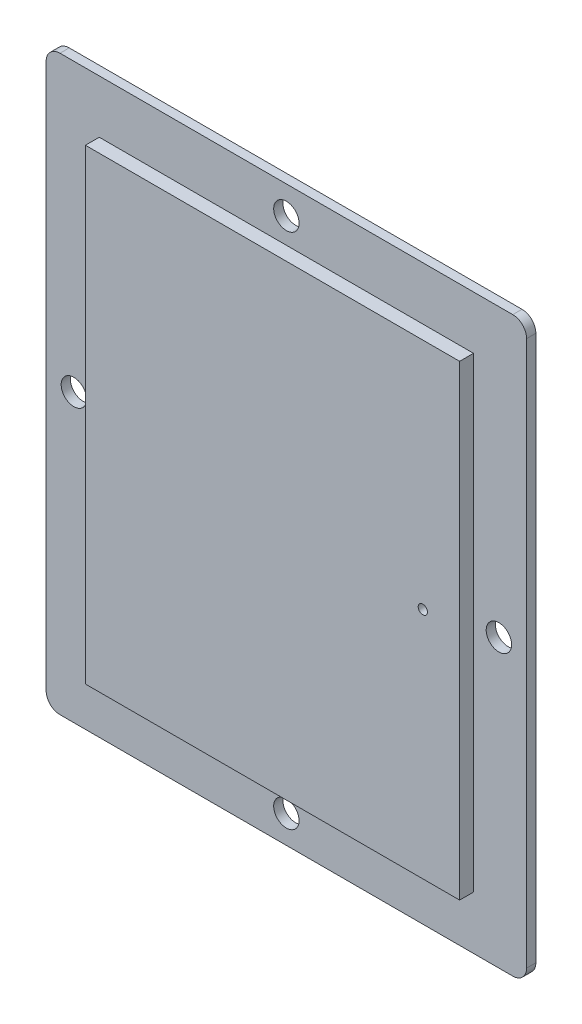
ISO-10303-21;
HEADER;
FILE_DESCRIPTION(('STEP AP214'),'2;1');
FILE_NAME('part.step','',(''),(''),'','','');
FILE_SCHEMA(('AUTOMOTIVE_DESIGN { 1 0 10303 214 1 1 1 1 }'));
ENDSEC;
DATA;
#1=APPLICATION_CONTEXT('core data for automotive mechanical design processes');
#2=APPLICATION_PROTOCOL_DEFINITION('international standard','automotive_design',2000,#1);
#3=PRODUCT_CONTEXT('',#1,'mechanical');
#4=PRODUCT('Part','Part','',(#3));
#5=PRODUCT_RELATED_PRODUCT_CATEGORY('part','',(#4));
#6=PRODUCT_DEFINITION_FORMATION('','',#4);
#7=PRODUCT_DEFINITION_CONTEXT('part definition',#1,'design');
#8=PRODUCT_DEFINITION('design','',#6,#7);
#9=PRODUCT_DEFINITION_SHAPE('','',#8);
#10=(LENGTH_UNIT() NAMED_UNIT(*) SI_UNIT(.MILLI.,.METRE.));
#11=(NAMED_UNIT(*) PLANE_ANGLE_UNIT() SI_UNIT($,.RADIAN.));
#12=(NAMED_UNIT(*) SI_UNIT($,.STERADIAN.) SOLID_ANGLE_UNIT());
#13=UNCERTAINTY_MEASURE_WITH_UNIT(LENGTH_MEASURE(1.E-05),#10,'distance_accuracy_value','');
#14=(GEOMETRIC_REPRESENTATION_CONTEXT(3) GLOBAL_UNCERTAINTY_ASSIGNED_CONTEXT((#13)) GLOBAL_UNIT_ASSIGNED_CONTEXT((#10,
#11,#12)) REPRESENTATION_CONTEXT('',''));
#15=CARTESIAN_POINT('',(0.,0.,0.));
#16=DIRECTION('',(0.,0.,1.));
#17=DIRECTION('',(1.,0.,0.));
#18=AXIS2_PLACEMENT_3D('',#15,#16,#17);
#19=CARTESIAN_POINT('',(0.,0.,2.));
#20=DIRECTION('',(0.,0.,-1.));
#21=DIRECTION('',(-1.,0.,0.));
#22=AXIS2_PLACEMENT_3D('',#19,#20,#21);
#23=PLANE('',#22);
#24=CARTESIAN_POINT('',(52.,6.,2.));
#25=DIRECTION('',(0.,0.,1.));
#26=DIRECTION('',(1.,0.,0.));
#27=AXIS2_PLACEMENT_3D('',#24,#25,#26);
#28=CIRCLE('',#27,2.75);
#29=CARTESIAN_POINT('',(54.75,6.,2.));
#30=VERTEX_POINT('',#29);
#31=EDGE_CURVE('E462',#30,#30,#28,.T.);
#32=ORIENTED_EDGE('',*,*,#31,.F.);
#33=EDGE_LOOP('',(#32));
#34=FACE_BOUND('',#33,.T.);
#35=CARTESIAN_POINT('',(52.,118.,2.));
#36=DIRECTION('',(0.,0.,1.));
#37=DIRECTION('',(1.,0.,0.));
#38=AXIS2_PLACEMENT_3D('',#35,#36,#37);
#39=CIRCLE('',#38,2.75);
#40=CARTESIAN_POINT('',(54.75,118.,2.));
#41=VERTEX_POINT('',#40);
#42=EDGE_CURVE('E459',#41,#41,#39,.T.);
#43=ORIENTED_EDGE('',*,*,#42,.F.);
#44=EDGE_LOOP('',(#43));
#45=FACE_BOUND('',#44,.T.);
#46=CARTESIAN_POINT('',(98.,62.,2.));
#47=DIRECTION('',(0.,0.,1.));
#48=DIRECTION('',(1.,0.,0.));
#49=AXIS2_PLACEMENT_3D('',#46,#47,#48);
#50=CIRCLE('',#49,2.75000000000001);
#51=CARTESIAN_POINT('',(100.75,62.,2.));
#52=VERTEX_POINT('',#51);
#53=EDGE_CURVE('E451',#52,#52,#50,.T.);
#54=ORIENTED_EDGE('',*,*,#53,.F.);
#55=EDGE_LOOP('',(#54));
#56=FACE_BOUND('',#55,.T.);
#57=CARTESIAN_POINT('',(6.,62.,2.));
#58=DIRECTION('',(0.,0.,1.));
#59=DIRECTION('',(1.,0.,0.));
#60=AXIS2_PLACEMENT_3D('',#57,#58,#59);
#61=CIRCLE('',#60,2.75);
#62=CARTESIAN_POINT('',(8.75,62.,2.));
#63=VERTEX_POINT('',#62);
#64=EDGE_CURVE('E447',#63,#63,#61,.T.);
#65=ORIENTED_EDGE('',*,*,#64,.F.);
#66=EDGE_LOOP('',(#65));
#67=FACE_BOUND('',#66,.T.);
#68=DIRECTION('',(0.,1.,0.));
#69=VECTOR('',#68,1.);
#70=CARTESIAN_POINT('',(104.,0.,2.));
#71=LINE('',#70,#69);
#72=CARTESIAN_POINT('',(104.,3.,2.));
#73=VERTEX_POINT('',#72);
#74=CARTESIAN_POINT('',(104.,121.,2.));
#75=VERTEX_POINT('',#74);
#76=EDGE_CURVE('E170',#73,#75,#71,.T.);
#77=ORIENTED_EDGE('',*,*,#76,.T.);
#78=CARTESIAN_POINT('',(101.,121.,2.));
#79=DIRECTION('',(0.,0.,-1.));
#80=DIRECTION('',(-1.,0.,0.));
#81=AXIS2_PLACEMENT_3D('',#78,#79,#80);
#82=CIRCLE('',#81,3.);
#83=CARTESIAN_POINT('',(101.,124.,2.));
#84=VERTEX_POINT('',#83);
#85=EDGE_CURVE('E204',#75,#84,#82,.F.);
#86=ORIENTED_EDGE('',*,*,#85,.T.);
#87=DIRECTION('',(1.,0.,0.));
#88=VECTOR('',#87,1.);
#89=CARTESIAN_POINT('',(0.,124.,2.));
#90=LINE('',#89,#88);
#91=CARTESIAN_POINT('',(2.99999999999998,124.,2.));
#92=VERTEX_POINT('',#91);
#93=EDGE_CURVE('E166',#92,#84,#90,.T.);
#94=ORIENTED_EDGE('',*,*,#93,.F.);
#95=CARTESIAN_POINT('',(2.99999999999998,121.,2.));
#96=DIRECTION('',(0.,0.,-1.));
#97=DIRECTION('',(-1.,0.,0.));
#98=AXIS2_PLACEMENT_3D('',#95,#96,#97);
#99=CIRCLE('',#98,3.);
#100=CARTESIAN_POINT('',(0.,121.,2.));
#101=VERTEX_POINT('',#100);
#102=EDGE_CURVE('E202',#92,#101,#99,.F.);
#103=ORIENTED_EDGE('',*,*,#102,.T.);
#104=DIRECTION('',(0.,1.,0.));
#105=VECTOR('',#104,1.);
#106=CARTESIAN_POINT('',(0.,0.,2.));
#107=LINE('',#106,#105);
#108=CARTESIAN_POINT('',(0.,3.,2.));
#109=VERTEX_POINT('',#108);
#110=EDGE_CURVE('E163',#109,#101,#107,.T.);
#111=ORIENTED_EDGE('',*,*,#110,.F.);
#112=CARTESIAN_POINT('',(3.,3.,2.));
#113=DIRECTION('',(0.,0.,-1.));
#114=DIRECTION('',(-1.,0.,0.));
#115=AXIS2_PLACEMENT_3D('',#112,#113,#114);
#116=CIRCLE('',#115,3.);
#117=CARTESIAN_POINT('',(3.,0.,2.));
#118=VERTEX_POINT('',#117);
#119=EDGE_CURVE('E60',#109,#118,#116,.F.);
#120=ORIENTED_EDGE('',*,*,#119,.T.);
#121=DIRECTION('',(1.,0.,0.));
#122=VECTOR('',#121,1.);
#123=CARTESIAN_POINT('',(0.,0.,2.));
#124=LINE('',#123,#122);
#125=CARTESIAN_POINT('',(101.,0.,2.));
#126=VERTEX_POINT('',#125);
#127=EDGE_CURVE('E173',#118,#126,#124,.T.);
#128=ORIENTED_EDGE('',*,*,#127,.T.);
#129=CARTESIAN_POINT('',(101.,3.,2.));
#130=DIRECTION('',(0.,0.,-1.));
#131=DIRECTION('',(-1.,0.,0.));
#132=AXIS2_PLACEMENT_3D('',#129,#130,#131);
#133=CIRCLE('',#132,3.);
#134=EDGE_CURVE('E199',#126,#73,#133,.F.);
#135=ORIENTED_EDGE('',*,*,#134,.T.);
#136=EDGE_LOOP('',(#77,#86,#94,#103,#111,#120,#128,#135));
#137=FACE_BOUND('',#136,.T.);
#138=DIRECTION('',(0.,1.,0.));
#139=VECTOR('',#138,1.);
#140=CARTESIAN_POINT('',(92.5,11.5,2.));
#141=LINE('',#140,#139);
#142=CARTESIAN_POINT('',(92.5,11.5,2.));
#143=VERTEX_POINT('',#142);
#144=CARTESIAN_POINT('',(92.5,112.5,2.));
#145=VERTEX_POINT('',#144);
#146=EDGE_CURVE('E153',#143,#145,#141,.T.);
#147=ORIENTED_EDGE('',*,*,#146,.F.);
#148=DIRECTION('',(1.,0.,0.));
#149=VECTOR('',#148,1.);
#150=CARTESIAN_POINT('',(11.5,11.5,2.));
#151=LINE('',#150,#149);
#152=CARTESIAN_POINT('',(11.5,11.5,2.));
#153=VERTEX_POINT('',#152);
#154=EDGE_CURVE('E150',#153,#143,#151,.T.);
#155=ORIENTED_EDGE('',*,*,#154,.F.);
#156=DIRECTION('',(0.,-1.,0.));
#157=VECTOR('',#156,1.);
#158=CARTESIAN_POINT('',(11.5,11.5,2.));
#159=LINE('',#158,#157);
#160=CARTESIAN_POINT('',(11.5,112.5,2.));
#161=VERTEX_POINT('',#160);
#162=EDGE_CURVE('E424',#161,#153,#159,.T.);
#163=ORIENTED_EDGE('',*,*,#162,.F.);
#164=DIRECTION('',(-1.,0.,0.));
#165=VECTOR('',#164,1.);
#166=CARTESIAN_POINT('',(11.5,112.5,2.));
#167=LINE('',#166,#165);
#168=EDGE_CURVE('E426',#145,#161,#167,.T.);
#169=ORIENTED_EDGE('',*,*,#168,.F.);
#170=EDGE_LOOP('',(#147,#155,#163,#169));
#171=FACE_BOUND('',#170,.T.);
#172=ADVANCED_FACE('F39',(#34,#45,#56,#67,#137,#171),#23,.F.);
#173=CARTESIAN_POINT('',(0.,0.,2.));
#174=DIRECTION('',(-1.,0.,0.));
#175=DIRECTION('',(0.,-1.,0.));
#176=AXIS2_PLACEMENT_3D('',#173,#174,#175);
#177=PLANE('',#176);
#178=ORIENTED_EDGE('',*,*,#110,.T.);
#179=DIRECTION('',(0.,0.,-1.));
#180=VECTOR('',#179,1.);
#181=CARTESIAN_POINT('',(0.,121.,2.));
#182=LINE('',#181,#180);
#183=CARTESIAN_POINT('',(0.,121.,0.));
#184=VERTEX_POINT('',#183);
#185=EDGE_CURVE('E208',#101,#184,#182,.T.);
#186=ORIENTED_EDGE('',*,*,#185,.T.);
#187=DIRECTION('',(0.,1.,0.));
#188=VECTOR('',#187,1.);
#189=CARTESIAN_POINT('',(0.,0.,0.));
#190=LINE('',#189,#188);
#191=CARTESIAN_POINT('',(0.,3.,0.));
#192=VERTEX_POINT('',#191);
#193=EDGE_CURVE('E154',#192,#184,#190,.T.);
#194=ORIENTED_EDGE('',*,*,#193,.F.);
#195=DIRECTION('',(0.,0.,-1.));
#196=VECTOR('',#195,1.);
#197=CARTESIAN_POINT('',(0.,3.,2.));
#198=LINE('',#197,#196);
#199=EDGE_CURVE('E206',#192,#109,#198,.F.);
#200=ORIENTED_EDGE('',*,*,#199,.T.);
#201=EDGE_LOOP('',(#178,#186,#194,#200));
#202=FACE_BOUND('',#201,.T.);
#203=ADVANCED_FACE('F213',(#202),#177,.T.);
#204=CARTESIAN_POINT('',(0.,0.,2.));
#205=DIRECTION('',(0.,1.,0.));
#206=DIRECTION('',(0.,0.,1.));
#207=AXIS2_PLACEMENT_3D('',#204,#205,#206);
#208=PLANE('',#207);
#209=ORIENTED_EDGE('',*,*,#127,.F.);
#210=DIRECTION('',(0.,0.,-1.));
#211=VECTOR('',#210,1.);
#212=CARTESIAN_POINT('',(3.,0.,0.));
#213=LINE('',#212,#211);
#214=CARTESIAN_POINT('',(3.,0.,0.));
#215=VERTEX_POINT('',#214);
#216=EDGE_CURVE('E11',#118,#215,#213,.T.);
#217=ORIENTED_EDGE('',*,*,#216,.T.);
#218=DIRECTION('',(1.,0.,0.));
#219=VECTOR('',#218,1.);
#220=CARTESIAN_POINT('',(0.,0.,0.));
#221=LINE('',#220,#219);
#222=CARTESIAN_POINT('',(101.,0.,0.));
#223=VERTEX_POINT('',#222);
#224=EDGE_CURVE('E167',#215,#223,#221,.T.);
#225=ORIENTED_EDGE('',*,*,#224,.T.);
#226=DIRECTION('',(0.,0.,-1.));
#227=VECTOR('',#226,1.);
#228=CARTESIAN_POINT('',(101.,0.,2.));
#229=LINE('',#228,#227);
#230=EDGE_CURVE('E47',#223,#126,#229,.F.);
#231=ORIENTED_EDGE('',*,*,#230,.T.);
#232=EDGE_LOOP('',(#209,#217,#225,#231));
#233=FACE_BOUND('',#232,.T.);
#234=ADVANCED_FACE('F224',(#233),#208,.F.);
#235=CARTESIAN_POINT('',(104.,0.,2.));
#236=DIRECTION('',(-1.,0.,0.));
#237=DIRECTION('',(0.,0.,1.));
#238=AXIS2_PLACEMENT_3D('',#235,#236,#237);
#239=PLANE('',#238);
#240=DIRECTION('',(0.,1.,0.));
#241=VECTOR('',#240,1.);
#242=CARTESIAN_POINT('',(104.,0.,0.));
#243=LINE('',#242,#241);
#244=CARTESIAN_POINT('',(104.,3.,0.));
#245=VERTEX_POINT('',#244);
#246=CARTESIAN_POINT('',(104.,121.,0.));
#247=VERTEX_POINT('',#246);
#248=EDGE_CURVE('E178',#245,#247,#243,.T.);
#249=ORIENTED_EDGE('',*,*,#248,.T.);
#250=DIRECTION('',(0.,0.,-1.));
#251=VECTOR('',#250,1.);
#252=CARTESIAN_POINT('',(104.,121.,2.));
#253=LINE('',#252,#251);
#254=EDGE_CURVE('E197',#247,#75,#253,.F.);
#255=ORIENTED_EDGE('',*,*,#254,.T.);
#256=ORIENTED_EDGE('',*,*,#76,.F.);
#257=DIRECTION('',(0.,0.,-1.));
#258=VECTOR('',#257,1.);
#259=CARTESIAN_POINT('',(104.,3.,2.));
#260=LINE('',#259,#258);
#261=EDGE_CURVE('E194',#73,#245,#260,.T.);
#262=ORIENTED_EDGE('',*,*,#261,.T.);
#263=EDGE_LOOP('',(#249,#255,#256,#262));
#264=FACE_BOUND('',#263,.T.);
#265=ADVANCED_FACE('F232',(#264),#239,.F.);
#266=CARTESIAN_POINT('',(0.,124.,2.));
#267=DIRECTION('',(0.,1.,0.));
#268=DIRECTION('',(0.,0.,1.));
#269=AXIS2_PLACEMENT_3D('',#266,#267,#268);
#270=PLANE('',#269);
#271=ORIENTED_EDGE('',*,*,#93,.T.);
#272=DIRECTION('',(0.,0.,-1.));
#273=VECTOR('',#272,1.);
#274=CARTESIAN_POINT('',(101.,124.,0.));
#275=LINE('',#274,#273);
#276=CARTESIAN_POINT('',(101.,124.,0.));
#277=VERTEX_POINT('',#276);
#278=EDGE_CURVE('E183',#84,#277,#275,.T.);
#279=ORIENTED_EDGE('',*,*,#278,.T.);
#280=DIRECTION('',(1.,0.,0.));
#281=VECTOR('',#280,1.);
#282=CARTESIAN_POINT('',(0.,124.,0.));
#283=LINE('',#282,#281);
#284=CARTESIAN_POINT('',(2.99999999999998,124.,0.));
#285=VERTEX_POINT('',#284);
#286=EDGE_CURVE('E157',#285,#277,#283,.T.);
#287=ORIENTED_EDGE('',*,*,#286,.F.);
#288=DIRECTION('',(0.,0.,-1.));
#289=VECTOR('',#288,1.);
#290=CARTESIAN_POINT('',(2.99999999999998,124.,2.));
#291=LINE('',#290,#289);
#292=EDGE_CURVE('E174',#285,#92,#291,.F.);
#293=ORIENTED_EDGE('',*,*,#292,.T.);
#294=EDGE_LOOP('',(#271,#279,#287,#293));
#295=FACE_BOUND('',#294,.T.);
#296=ADVANCED_FACE('F239',(#295),#270,.T.);
#297=CARTESIAN_POINT('',(0.,0.,0.));
#298=DIRECTION('',(0.,0.,-1.));
#299=DIRECTION('',(-1.,0.,0.));
#300=AXIS2_PLACEMENT_3D('',#297,#298,#299);
#301=PLANE('',#300);
#302=CARTESIAN_POINT('',(52.,6.,0.));
#303=DIRECTION('',(0.,0.,1.));
#304=DIRECTION('',(1.,0.,0.));
#305=AXIS2_PLACEMENT_3D('',#302,#303,#304);
#306=CIRCLE('',#305,2.75);
#307=CARTESIAN_POINT('',(54.75,6.,0.));
#308=VERTEX_POINT('',#307);
#309=EDGE_CURVE('E448',#308,#308,#306,.T.);
#310=ORIENTED_EDGE('',*,*,#309,.T.);
#311=EDGE_LOOP('',(#310));
#312=FACE_BOUND('',#311,.T.);
#313=CARTESIAN_POINT('',(52.,118.,0.));
#314=DIRECTION('',(0.,0.,1.));
#315=DIRECTION('',(1.,0.,0.));
#316=AXIS2_PLACEMENT_3D('',#313,#314,#315);
#317=CIRCLE('',#316,2.75);
#318=CARTESIAN_POINT('',(54.75,118.,0.));
#319=VERTEX_POINT('',#318);
#320=EDGE_CURVE('E456',#319,#319,#317,.T.);
#321=ORIENTED_EDGE('',*,*,#320,.T.);
#322=EDGE_LOOP('',(#321));
#323=FACE_BOUND('',#322,.T.);
#324=CARTESIAN_POINT('',(98.,62.,0.));
#325=DIRECTION('',(0.,0.,1.));
#326=DIRECTION('',(1.,0.,0.));
#327=AXIS2_PLACEMENT_3D('',#324,#325,#326);
#328=CIRCLE('',#327,2.75000000000001);
#329=CARTESIAN_POINT('',(100.75,62.,0.));
#330=VERTEX_POINT('',#329);
#331=EDGE_CURVE('E441',#330,#330,#328,.T.);
#332=ORIENTED_EDGE('',*,*,#331,.T.);
#333=EDGE_LOOP('',(#332));
#334=FACE_BOUND('',#333,.T.);
#335=CARTESIAN_POINT('',(6.,62.,0.));
#336=DIRECTION('',(0.,0.,1.));
#337=DIRECTION('',(1.,0.,0.));
#338=AXIS2_PLACEMENT_3D('',#335,#336,#337);
#339=CIRCLE('',#338,2.75);
#340=CARTESIAN_POINT('',(8.75,62.,0.));
#341=VERTEX_POINT('',#340);
#342=EDGE_CURVE('E444',#341,#341,#339,.T.);
#343=ORIENTED_EDGE('',*,*,#342,.T.);
#344=EDGE_LOOP('',(#343));
#345=FACE_BOUND('',#344,.T.);
#346=CARTESIAN_POINT('',(84.5332286610323,62.,0.));
#347=DIRECTION('',(0.,0.,1.));
#348=DIRECTION('',(1.,0.,0.));
#349=AXIS2_PLACEMENT_3D('',#346,#347,#348);
#350=CIRCLE('',#349,0.999999999999998);
#351=CARTESIAN_POINT('',(85.5332286610323,62.,0.));
#352=VERTEX_POINT('',#351);
#353=EDGE_CURVE('E435',#352,#352,#350,.T.);
#354=ORIENTED_EDGE('',*,*,#353,.T.);
#355=EDGE_LOOP('',(#354));
#356=FACE_BOUND('',#355,.T.);
#357=ORIENTED_EDGE('',*,*,#286,.T.);
#358=CARTESIAN_POINT('',(101.,121.,0.));
#359=DIRECTION('',(0.,0.,-1.));
#360=DIRECTION('',(-1.,0.,0.));
#361=AXIS2_PLACEMENT_3D('',#358,#359,#360);
#362=CIRCLE('',#361,3.);
#363=EDGE_CURVE('E192',#277,#247,#362,.T.);
#364=ORIENTED_EDGE('',*,*,#363,.T.);
#365=ORIENTED_EDGE('',*,*,#248,.F.);
#366=CARTESIAN_POINT('',(101.,3.,0.));
#367=DIRECTION('',(0.,0.,-1.));
#368=DIRECTION('',(-1.,0.,0.));
#369=AXIS2_PLACEMENT_3D('',#366,#367,#368);
#370=CIRCLE('',#369,3.);
#371=EDGE_CURVE('E186',#245,#223,#370,.T.);
#372=ORIENTED_EDGE('',*,*,#371,.T.);
#373=ORIENTED_EDGE('',*,*,#224,.F.);
#374=CARTESIAN_POINT('',(3.,3.,0.));
#375=DIRECTION('',(0.,0.,-1.));
#376=DIRECTION('',(-1.,0.,0.));
#377=AXIS2_PLACEMENT_3D('',#374,#375,#376);
#378=CIRCLE('',#377,3.);
#379=EDGE_CURVE('E188',#215,#192,#378,.T.);
#380=ORIENTED_EDGE('',*,*,#379,.T.);
#381=ORIENTED_EDGE('',*,*,#193,.T.);
#382=CARTESIAN_POINT('',(2.99999999999998,121.,0.));
#383=DIRECTION('',(0.,0.,-1.));
#384=DIRECTION('',(-1.,0.,0.));
#385=AXIS2_PLACEMENT_3D('',#382,#383,#384);
#386=CIRCLE('',#385,3.);
#387=EDGE_CURVE('E190',#184,#285,#386,.T.);
#388=ORIENTED_EDGE('',*,*,#387,.T.);
#389=EDGE_LOOP('',(#357,#364,#365,#372,#373,#380,#381,#388));
#390=FACE_BOUND('',#389,.T.);
#391=ADVANCED_FACE('F218',(#312,#323,#334,#345,#356,#390),#301,.T.);
#392=CARTESIAN_POINT('',(92.5,11.5,5.));
#393=DIRECTION('',(-1.,0.,0.));
#394=DIRECTION('',(0.,0.,1.));
#395=AXIS2_PLACEMENT_3D('',#392,#393,#394);
#396=PLANE('',#395);
#397=ORIENTED_EDGE('',*,*,#146,.T.);
#398=DIRECTION('',(0.,0.,-1.));
#399=VECTOR('',#398,1.);
#400=CARTESIAN_POINT('',(92.5,112.5,5.));
#401=LINE('',#400,#399);
#402=CARTESIAN_POINT('',(92.5,112.5,5.));
#403=VERTEX_POINT('',#402);
#404=EDGE_CURVE('E134',#403,#145,#401,.T.);
#405=ORIENTED_EDGE('',*,*,#404,.F.);
#406=DIRECTION('',(0.,1.,0.));
#407=VECTOR('',#406,1.);
#408=CARTESIAN_POINT('',(92.5,11.5,5.));
#409=LINE('',#408,#407);
#410=CARTESIAN_POINT('',(92.5,11.5,5.));
#411=VERTEX_POINT('',#410);
#412=EDGE_CURVE('E141',#411,#403,#409,.T.);
#413=ORIENTED_EDGE('',*,*,#412,.F.);
#414=DIRECTION('',(0.,0.,-1.));
#415=VECTOR('',#414,1.);
#416=CARTESIAN_POINT('',(92.5,11.5,5.));
#417=LINE('',#416,#415);
#418=EDGE_CURVE('E429',#411,#143,#417,.T.);
#419=ORIENTED_EDGE('',*,*,#418,.T.);
#420=EDGE_LOOP('',(#397,#405,#413,#419));
#421=FACE_BOUND('',#420,.T.);
#422=ADVANCED_FACE('F152',(#421),#396,.F.);
#423=CARTESIAN_POINT('',(11.5,112.5,5.));
#424=DIRECTION('',(0.,-1.,0.));
#425=DIRECTION('',(0.,0.,-1.));
#426=AXIS2_PLACEMENT_3D('',#423,#424,#425);
#427=PLANE('',#426);
#428=ORIENTED_EDGE('',*,*,#168,.T.);
#429=DIRECTION('',(0.,0.,-1.));
#430=VECTOR('',#429,1.);
#431=CARTESIAN_POINT('',(11.5,112.5,5.));
#432=LINE('',#431,#430);
#433=CARTESIAN_POINT('',(11.5,112.5,5.));
#434=VERTEX_POINT('',#433);
#435=EDGE_CURVE('E137',#434,#161,#432,.T.);
#436=ORIENTED_EDGE('',*,*,#435,.F.);
#437=DIRECTION('',(-1.,0.,0.));
#438=VECTOR('',#437,1.);
#439=CARTESIAN_POINT('',(11.5,112.5,5.));
#440=LINE('',#439,#438);
#441=EDGE_CURVE('E129',#403,#434,#440,.T.);
#442=ORIENTED_EDGE('',*,*,#441,.F.);
#443=ORIENTED_EDGE('',*,*,#404,.T.);
#444=EDGE_LOOP('',(#428,#436,#442,#443));
#445=FACE_BOUND('',#444,.T.);
#446=ADVANCED_FACE('F132',(#445),#427,.F.);
#447=CARTESIAN_POINT('',(11.5,11.5,5.));
#448=DIRECTION('',(1.,0.,0.));
#449=DIRECTION('',(0.,0.,-1.));
#450=AXIS2_PLACEMENT_3D('',#447,#448,#449);
#451=PLANE('',#450);
#452=ORIENTED_EDGE('',*,*,#162,.T.);
#453=DIRECTION('',(0.,0.,-1.));
#454=VECTOR('',#453,1.);
#455=CARTESIAN_POINT('',(11.5,11.5,5.));
#456=LINE('',#455,#454);
#457=CARTESIAN_POINT('',(11.5,11.5,5.));
#458=VERTEX_POINT('',#457);
#459=EDGE_CURVE('E159',#458,#153,#456,.T.);
#460=ORIENTED_EDGE('',*,*,#459,.F.);
#461=DIRECTION('',(0.,-1.,0.));
#462=VECTOR('',#461,1.);
#463=CARTESIAN_POINT('',(11.5,11.5,5.));
#464=LINE('',#463,#462);
#465=EDGE_CURVE('E140',#434,#458,#464,.T.);
#466=ORIENTED_EDGE('',*,*,#465,.F.);
#467=ORIENTED_EDGE('',*,*,#435,.T.);
#468=EDGE_LOOP('',(#452,#460,#466,#467));
#469=FACE_BOUND('',#468,.T.);
#470=ADVANCED_FACE('F359',(#469),#451,.F.);
#471=CARTESIAN_POINT('',(11.5,11.5,5.));
#472=DIRECTION('',(0.,1.,0.));
#473=DIRECTION('',(0.,0.,1.));
#474=AXIS2_PLACEMENT_3D('',#471,#472,#473);
#475=PLANE('',#474);
#476=ORIENTED_EDGE('',*,*,#154,.T.);
#477=ORIENTED_EDGE('',*,*,#418,.F.);
#478=DIRECTION('',(1.,0.,0.));
#479=VECTOR('',#478,1.);
#480=CARTESIAN_POINT('',(11.5,11.5,5.));
#481=LINE('',#480,#479);
#482=EDGE_CURVE('E146',#458,#411,#481,.T.);
#483=ORIENTED_EDGE('',*,*,#482,.F.);
#484=ORIENTED_EDGE('',*,*,#459,.T.);
#485=EDGE_LOOP('',(#476,#477,#483,#484));
#486=FACE_BOUND('',#485,.T.);
#487=ADVANCED_FACE('F355',(#486),#475,.F.);
#488=CARTESIAN_POINT('',(0.,0.,5.));
#489=DIRECTION('',(0.,0.,-1.));
#490=DIRECTION('',(-1.,0.,0.));
#491=AXIS2_PLACEMENT_3D('',#488,#489,#490);
#492=PLANE('',#491);
#493=CARTESIAN_POINT('',(84.5332286610323,62.,5.));
#494=DIRECTION('',(0.,0.,1.));
#495=DIRECTION('',(1.,0.,0.));
#496=AXIS2_PLACEMENT_3D('',#493,#494,#495);
#497=CIRCLE('',#496,0.999999999999998);
#498=CARTESIAN_POINT('',(85.5332286610323,62.,5.));
#499=VERTEX_POINT('',#498);
#500=EDGE_CURVE('E438',#499,#499,#497,.T.);
#501=ORIENTED_EDGE('',*,*,#500,.F.);
#502=EDGE_LOOP('',(#501));
#503=FACE_BOUND('',#502,.T.);
#504=ORIENTED_EDGE('',*,*,#412,.T.);
#505=ORIENTED_EDGE('',*,*,#441,.T.);
#506=ORIENTED_EDGE('',*,*,#465,.T.);
#507=ORIENTED_EDGE('',*,*,#482,.T.);
#508=EDGE_LOOP('',(#504,#505,#506,#507));
#509=FACE_BOUND('',#508,.T.);
#510=ADVANCED_FACE('F144',(#503,#509),#492,.F.);
#511=CARTESIAN_POINT('',(84.5332286610323,62.,0.));
#512=DIRECTION('',(0.,0.,1.));
#513=DIRECTION('',(1.,0.,0.));
#514=AXIS2_PLACEMENT_3D('',#511,#512,#513);
#515=CYLINDRICAL_SURFACE('',#514,0.999999999999998);
#516=ORIENTED_EDGE('',*,*,#353,.F.);
#517=EDGE_LOOP('',(#516));
#518=FACE_BOUND('',#517,.T.);
#519=ORIENTED_EDGE('',*,*,#500,.T.);
#520=EDGE_LOOP('',(#519));
#521=FACE_BOUND('',#520,.T.);
#522=ADVANCED_FACE('F249',(#518,#521),#515,.F.);
#523=CARTESIAN_POINT('',(101.,121.,2.));
#524=DIRECTION('',(0.,0.,1.));
#525=DIRECTION('',(1.,0.,0.));
#526=AXIS2_PLACEMENT_3D('',#523,#524,#525);
#527=CYLINDRICAL_SURFACE('',#526,3.);
#528=ORIENTED_EDGE('',*,*,#85,.F.);
#529=ORIENTED_EDGE('',*,*,#254,.F.);
#530=ORIENTED_EDGE('',*,*,#363,.F.);
#531=ORIENTED_EDGE('',*,*,#278,.F.);
#532=EDGE_LOOP('',(#528,#529,#530,#531));
#533=FACE_BOUND('',#532,.T.);
#534=ADVANCED_FACE('F237',(#533),#527,.T.);
#535=CARTESIAN_POINT('',(2.99999999999998,121.,2.));
#536=DIRECTION('',(0.,0.,-1.));
#537=DIRECTION('',(-1.,0.,0.));
#538=AXIS2_PLACEMENT_3D('',#535,#536,#537);
#539=CYLINDRICAL_SURFACE('',#538,3.);
#540=ORIENTED_EDGE('',*,*,#102,.F.);
#541=ORIENTED_EDGE('',*,*,#292,.F.);
#542=ORIENTED_EDGE('',*,*,#387,.F.);
#543=ORIENTED_EDGE('',*,*,#185,.F.);
#544=EDGE_LOOP('',(#540,#541,#542,#543));
#545=FACE_BOUND('',#544,.T.);
#546=ADVANCED_FACE('F242',(#545),#539,.T.);
#547=CARTESIAN_POINT('',(3.,3.,2.));
#548=DIRECTION('',(0.,0.,1.));
#549=DIRECTION('',(1.,0.,0.));
#550=AXIS2_PLACEMENT_3D('',#547,#548,#549);
#551=CYLINDRICAL_SURFACE('',#550,3.);
#552=ORIENTED_EDGE('',*,*,#119,.F.);
#553=ORIENTED_EDGE('',*,*,#199,.F.);
#554=ORIENTED_EDGE('',*,*,#379,.F.);
#555=ORIENTED_EDGE('',*,*,#216,.F.);
#556=EDGE_LOOP('',(#552,#553,#554,#555));
#557=FACE_BOUND('',#556,.T.);
#558=ADVANCED_FACE('F223',(#557),#551,.T.);
#559=CARTESIAN_POINT('',(101.,3.,2.));
#560=DIRECTION('',(0.,0.,-1.));
#561=DIRECTION('',(-1.,0.,0.));
#562=AXIS2_PLACEMENT_3D('',#559,#560,#561);
#563=CYLINDRICAL_SURFACE('',#562,3.);
#564=ORIENTED_EDGE('',*,*,#134,.F.);
#565=ORIENTED_EDGE('',*,*,#230,.F.);
#566=ORIENTED_EDGE('',*,*,#371,.F.);
#567=ORIENTED_EDGE('',*,*,#261,.F.);
#568=EDGE_LOOP('',(#564,#565,#566,#567));
#569=FACE_BOUND('',#568,.T.);
#570=ADVANCED_FACE('F41',(#569),#563,.T.);
#571=CARTESIAN_POINT('',(6.,62.,0.));
#572=DIRECTION('',(0.,0.,1.));
#573=DIRECTION('',(1.,0.,0.));
#574=AXIS2_PLACEMENT_3D('',#571,#572,#573);
#575=CYLINDRICAL_SURFACE('',#574,2.75);
#576=ORIENTED_EDGE('',*,*,#342,.F.);
#577=EDGE_LOOP('',(#576));
#578=FACE_BOUND('',#577,.T.);
#579=ORIENTED_EDGE('',*,*,#64,.T.);
#580=EDGE_LOOP('',(#579));
#581=FACE_BOUND('',#580,.T.);
#582=ADVANCED_FACE('F308',(#578,#581),#575,.F.);
#583=CARTESIAN_POINT('',(98.,62.,0.));
#584=DIRECTION('',(0.,0.,1.));
#585=DIRECTION('',(1.,0.,0.));
#586=AXIS2_PLACEMENT_3D('',#583,#584,#585);
#587=CYLINDRICAL_SURFACE('',#586,2.75000000000001);
#588=ORIENTED_EDGE('',*,*,#331,.F.);
#589=EDGE_LOOP('',(#588));
#590=FACE_BOUND('',#589,.T.);
#591=ORIENTED_EDGE('',*,*,#53,.T.);
#592=EDGE_LOOP('',(#591));
#593=FACE_BOUND('',#592,.T.);
#594=ADVANCED_FACE('F316',(#590,#593),#587,.F.);
#595=CARTESIAN_POINT('',(52.,118.,0.));
#596=DIRECTION('',(0.,0.,1.));
#597=DIRECTION('',(1.,0.,0.));
#598=AXIS2_PLACEMENT_3D('',#595,#596,#597);
#599=CYLINDRICAL_SURFACE('',#598,2.75);
#600=ORIENTED_EDGE('',*,*,#320,.F.);
#601=EDGE_LOOP('',(#600));
#602=FACE_BOUND('',#601,.T.);
#603=ORIENTED_EDGE('',*,*,#42,.T.);
#604=EDGE_LOOP('',(#603));
#605=FACE_BOUND('',#604,.T.);
#606=ADVANCED_FACE('F325',(#602,#605),#599,.F.);
#607=CARTESIAN_POINT('',(52.,6.,0.));
#608=DIRECTION('',(0.,0.,1.));
#609=DIRECTION('',(1.,0.,0.));
#610=AXIS2_PLACEMENT_3D('',#607,#608,#609);
#611=CYLINDRICAL_SURFACE('',#610,2.75);
#612=ORIENTED_EDGE('',*,*,#309,.F.);
#613=EDGE_LOOP('',(#612));
#614=FACE_BOUND('',#613,.T.);
#615=ORIENTED_EDGE('',*,*,#31,.T.);
#616=EDGE_LOOP('',(#615));
#617=FACE_BOUND('',#616,.T.);
#618=ADVANCED_FACE('F335',(#614,#617),#611,.F.);
#619=CLOSED_SHELL('',(#172,#203,#234,#265,#296,#391,#422,#446,#470,#487,#510,#522,#534,#546,
#558,#570,#582,#594,#606,#618));
#620=MANIFOLD_SOLID_BREP('B2',#619);
#621=ADVANCED_BREP_SHAPE_REPRESENTATION('',(#18,#620),#14);
#622=SHAPE_DEFINITION_REPRESENTATION(#9,#621);
ENDSEC;
END-ISO-10303-21;
